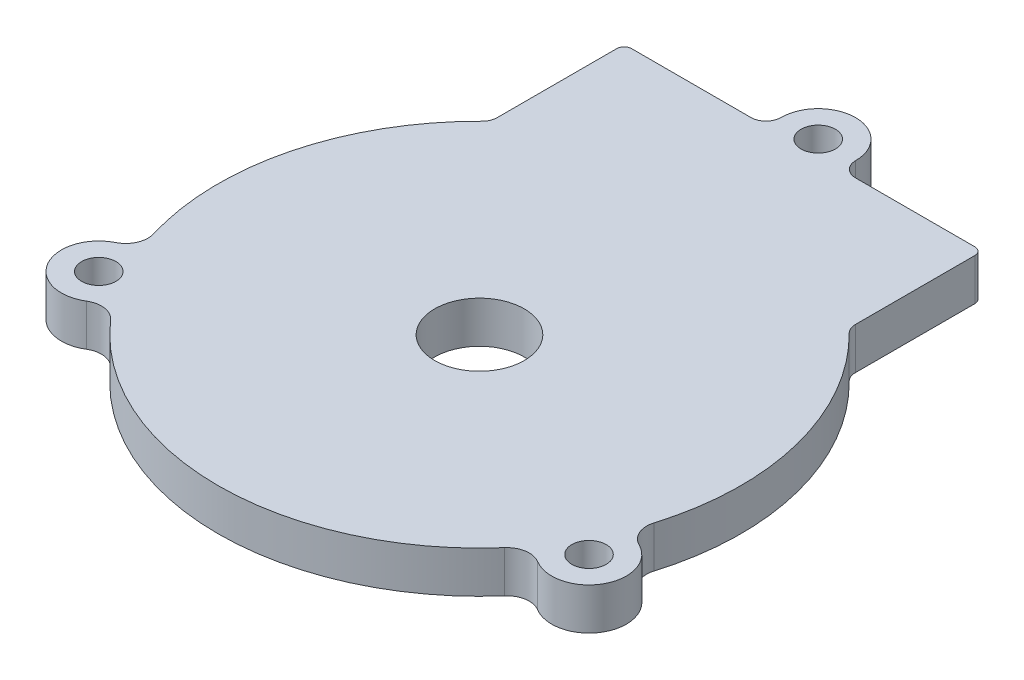
ISO-10303-21;
HEADER;
FILE_DESCRIPTION(('STEP AP214'),'2;1');
FILE_NAME('part.step','',(''),(''),'','','');
FILE_SCHEMA(('AUTOMOTIVE_DESIGN { 1 0 10303 214 1 1 1 1 }'));
ENDSEC;
DATA;
#1=APPLICATION_CONTEXT('core data for automotive mechanical design processes');
#2=APPLICATION_PROTOCOL_DEFINITION('international standard','automotive_design',2000,#1);
#3=PRODUCT_CONTEXT('',#1,'mechanical');
#4=PRODUCT('Part','Part','',(#3));
#5=PRODUCT_RELATED_PRODUCT_CATEGORY('part','',(#4));
#6=PRODUCT_DEFINITION_FORMATION('','',#4);
#7=PRODUCT_DEFINITION_CONTEXT('part definition',#1,'design');
#8=PRODUCT_DEFINITION('design','',#6,#7);
#9=PRODUCT_DEFINITION_SHAPE('','',#8);
#10=(LENGTH_UNIT() NAMED_UNIT(*) SI_UNIT(.MILLI.,.METRE.));
#11=(NAMED_UNIT(*) PLANE_ANGLE_UNIT() SI_UNIT($,.RADIAN.));
#12=(NAMED_UNIT(*) SI_UNIT($,.STERADIAN.) SOLID_ANGLE_UNIT());
#13=UNCERTAINTY_MEASURE_WITH_UNIT(LENGTH_MEASURE(1.E-05),#10,'distance_accuracy_value','');
#14=(GEOMETRIC_REPRESENTATION_CONTEXT(3) GLOBAL_UNCERTAINTY_ASSIGNED_CONTEXT((#13)) GLOBAL_UNIT_ASSIGNED_CONTEXT((#10,
#11,#12)) REPRESENTATION_CONTEXT('',''));
#15=CARTESIAN_POINT('',(0.,0.,0.));
#16=DIRECTION('',(0.,0.,1.));
#17=DIRECTION('',(1.,0.,0.));
#18=AXIS2_PLACEMENT_3D('',#15,#16,#17);
#19=CARTESIAN_POINT('',(32.785,5.588,-68.7014714818341));
#20=DIRECTION('',(0.,-1.,0.));
#21=DIRECTION('',(0.,0.,-1.));
#22=AXIS2_PLACEMENT_3D('',#19,#20,#21);
#23=CYLINDRICAL_SURFACE('',#22,5.);
#24=CARTESIAN_POINT('',(32.785,0.,-68.7014714818341));
#25=DIRECTION('',(0.,1.,0.));
#26=DIRECTION('',(0.,0.,1.));
#27=AXIS2_PLACEMENT_3D('',#24,#25,#26);
#28=CIRCLE('',#27,5.);
#29=CARTESIAN_POINT('',(37.785,0.,-68.7014714818341));
#30=VERTEX_POINT('',#29);
#31=CARTESIAN_POINT('',(27.785,0.,-68.7014714818341));
#32=VERTEX_POINT('',#31);
#33=EDGE_CURVE('E279',#30,#32,#28,.T.);
#34=ORIENTED_EDGE('',*,*,#33,.T.);
#35=DIRECTION('',(0.,-1.,0.));
#36=VECTOR('',#35,1.);
#37=CARTESIAN_POINT('',(27.785,5.588,-68.7014714818341));
#38=LINE('',#37,#36);
#39=CARTESIAN_POINT('',(27.785,5.588,-68.7014714818341));
#40=VERTEX_POINT('',#39);
#41=EDGE_CURVE('E312',#32,#40,#38,.F.);
#42=ORIENTED_EDGE('',*,*,#41,.T.);
#43=CARTESIAN_POINT('',(32.785,5.588,-68.7014714818341));
#44=DIRECTION('',(0.,1.,0.));
#45=DIRECTION('',(0.,0.,1.));
#46=AXIS2_PLACEMENT_3D('',#43,#44,#45);
#47=CIRCLE('',#46,5.);
#48=CARTESIAN_POINT('',(37.785,5.588,-68.7014714818341));
#49=VERTEX_POINT('',#48);
#50=EDGE_CURVE('E381',#49,#40,#47,.T.);
#51=ORIENTED_EDGE('',*,*,#50,.F.);
#52=DIRECTION('',(0.,-1.,0.));
#53=VECTOR('',#52,1.);
#54=CARTESIAN_POINT('',(37.785,5.588,-68.7014714818341));
#55=LINE('',#54,#53);
#56=EDGE_CURVE('E309',#49,#30,#55,.T.);
#57=ORIENTED_EDGE('',*,*,#56,.T.);
#58=EDGE_LOOP('',(#34,#42,#51,#57));
#59=FACE_BOUND('',#58,.T.);
#60=ADVANCED_FACE('F105',(#59),#23,.T.);
#61=CARTESIAN_POINT('',(56.765,5.588,-66.7014714818341));
#62=DIRECTION('',(0.,0.,1.));
#63=DIRECTION('',(1.,0.,0.));
#64=AXIS2_PLACEMENT_3D('',#61,#62,#63);
#65=PLANE('',#64);
#66=DIRECTION('',(-1.,0.,0.));
#67=VECTOR('',#66,1.);
#68=CARTESIAN_POINT('',(56.765,5.588,-66.7014714818341));
#69=LINE('',#68,#67);
#70=CARTESIAN_POINT('',(55.765,5.588,-66.7014714818341));
#71=VERTEX_POINT('',#70);
#72=CARTESIAN_POINT('',(39.785,5.588,-66.7014714818341));
#73=VERTEX_POINT('',#72);
#74=EDGE_CURVE('E364',#71,#73,#69,.T.);
#75=ORIENTED_EDGE('',*,*,#74,.F.);
#76=DIRECTION('',(0.,-1.,0.));
#77=VECTOR('',#76,1.);
#78=CARTESIAN_POINT('',(55.765,0.,-66.7014714818341));
#79=LINE('',#78,#77);
#80=CARTESIAN_POINT('',(55.765,0.,-66.7014714818341));
#81=VERTEX_POINT('',#80);
#82=EDGE_CURVE('E113',#71,#81,#79,.T.);
#83=ORIENTED_EDGE('',*,*,#82,.T.);
#84=DIRECTION('',(-1.,0.,0.));
#85=VECTOR('',#84,1.);
#86=CARTESIAN_POINT('',(56.765,0.,-66.7014714818341));
#87=LINE('',#86,#85);
#88=CARTESIAN_POINT('',(39.785,0.,-66.7014714818341));
#89=VERTEX_POINT('',#88);
#90=EDGE_CURVE('E363',#81,#89,#87,.T.);
#91=ORIENTED_EDGE('',*,*,#90,.T.);
#92=DIRECTION('',(0.,1.,0.));
#93=VECTOR('',#92,1.);
#94=CARTESIAN_POINT('',(39.785,5.588,-66.7014714818341));
#95=LINE('',#94,#93);
#96=EDGE_CURVE('E317',#89,#73,#95,.T.);
#97=ORIENTED_EDGE('',*,*,#96,.T.);
#98=EDGE_LOOP('',(#75,#83,#91,#97));
#99=FACE_BOUND('',#98,.T.);
#100=ADVANCED_FACE('F362',(#99),#65,.F.);
#101=CARTESIAN_POINT('',(65.600049900922,5.588,-5.20147148183409));
#102=DIRECTION('',(0.,-1.,0.));
#103=DIRECTION('',(0.,0.,-1.));
#104=AXIS2_PLACEMENT_3D('',#101,#102,#103);
#105=CYLINDRICAL_SURFACE('',#104,2.29999999999999);
#106=CARTESIAN_POINT('',(65.600049900922,5.588,-5.20147148183409));
#107=DIRECTION('',(0.,1.,0.));
#108=DIRECTION('',(0.,0.,1.));
#109=AXIS2_PLACEMENT_3D('',#106,#107,#108);
#110=CIRCLE('',#109,2.29999999999999);
#111=CARTESIAN_POINT('',(65.600049900922,5.588,-2.9014714818341));
#112=VERTEX_POINT('',#111);
#113=EDGE_CURVE('E405',#112,#112,#110,.T.);
#114=ORIENTED_EDGE('',*,*,#113,.T.);
#115=EDGE_LOOP('',(#114));
#116=FACE_BOUND('',#115,.T.);
#117=CARTESIAN_POINT('',(65.600049900922,0.,-5.20147148183409));
#118=DIRECTION('',(0.,1.,0.));
#119=DIRECTION('',(0.,0.,1.));
#120=AXIS2_PLACEMENT_3D('',#117,#118,#119);
#121=CIRCLE('',#120,2.29999999999999);
#122=CARTESIAN_POINT('',(65.600049900922,0.,-2.9014714818341));
#123=VERTEX_POINT('',#122);
#124=EDGE_CURVE('E409',#123,#123,#121,.T.);
#125=ORIENTED_EDGE('',*,*,#124,.F.);
#126=EDGE_LOOP('',(#125));
#127=FACE_BOUND('',#126,.T.);
#128=ADVANCED_FACE('F490',(#116,#127),#105,.F.);
#129=CARTESIAN_POINT('',(25.785,0.,-66.7014714818341));
#130=VERTEX_POINT('',#129);
#131=CARTESIAN_POINT('',(9.80499999999999,0.,-66.7014714818341));
#132=VERTEX_POINT('',#131);
#133=EDGE_CURVE('E373',#130,#132,#87,.T.);
#134=ORIENTED_EDGE('',*,*,#133,.T.);
#135=DIRECTION('',(0.,-1.,0.));
#136=VECTOR('',#135,1.);
#137=CARTESIAN_POINT('',(9.80499999999999,5.588,-66.7014714818341));
#138=LINE('',#137,#136);
#139=CARTESIAN_POINT('',(9.80499999999999,5.588,-66.7014714818341));
#140=VERTEX_POINT('',#139);
#141=EDGE_CURVE('E354',#132,#140,#138,.F.);
#142=ORIENTED_EDGE('',*,*,#141,.T.);
#143=CARTESIAN_POINT('',(25.785,5.588,-66.7014714818341));
#144=VERTEX_POINT('',#143);
#145=EDGE_CURVE('E427',#144,#140,#69,.T.);
#146=ORIENTED_EDGE('',*,*,#145,.F.);
#147=DIRECTION('',(0.,1.,0.));
#148=VECTOR('',#147,1.);
#149=CARTESIAN_POINT('',(25.785,0.,-66.7014714818341));
#150=LINE('',#149,#148);
#151=EDGE_CURVE('E315',#144,#130,#150,.F.);
#152=ORIENTED_EDGE('',*,*,#151,.T.);
#153=EDGE_LOOP('',(#134,#142,#146,#152));
#154=FACE_BOUND('',#153,.T.);
#155=ADVANCED_FACE('F492',(#154),#65,.F.);
#156=CARTESIAN_POINT('',(56.765,5.588,-66.7014714818341));
#157=DIRECTION('',(1.,0.,0.));
#158=DIRECTION('',(0.,0.,-1.));
#159=AXIS2_PLACEMENT_3D('',#156,#157,#158);
#160=PLANE('',#159);
#161=DIRECTION('',(0.,0.,1.));
#162=VECTOR('',#161,1.);
#163=CARTESIAN_POINT('',(56.765,0.,-66.7014714818341));
#164=LINE('',#163,#162);
#165=CARTESIAN_POINT('',(56.765,0.,-65.7014714818341));
#166=VERTEX_POINT('',#165);
#167=CARTESIAN_POINT('',(56.765,0.,-49.6961028134736));
#168=VERTEX_POINT('',#167);
#169=EDGE_CURVE('E383',#166,#168,#164,.T.);
#170=ORIENTED_EDGE('',*,*,#169,.F.);
#171=DIRECTION('',(0.,-1.,0.));
#172=VECTOR('',#171,1.);
#173=CARTESIAN_POINT('',(56.765,5.588,-65.7014714818341));
#174=LINE('',#173,#172);
#175=CARTESIAN_POINT('',(56.765,5.588,-65.7014714818341));
#176=VERTEX_POINT('',#175);
#177=EDGE_CURVE('E12',#166,#176,#174,.F.);
#178=ORIENTED_EDGE('',*,*,#177,.T.);
#179=DIRECTION('',(0.,0.,1.));
#180=VECTOR('',#179,1.);
#181=CARTESIAN_POINT('',(56.765,5.588,-66.7014714818341));
#182=LINE('',#181,#180);
#183=CARTESIAN_POINT('',(56.765,5.588,-49.6961028134736));
#184=VERTEX_POINT('',#183);
#185=EDGE_CURVE('E372',#176,#184,#182,.T.);
#186=ORIENTED_EDGE('',*,*,#185,.T.);
#187=DIRECTION('',(0.,-1.,0.));
#188=VECTOR('',#187,1.);
#189=CARTESIAN_POINT('',(56.765,5.588,-49.6961028134736));
#190=LINE('',#189,#188);
#191=EDGE_CURVE('E330',#184,#168,#190,.T.);
#192=ORIENTED_EDGE('',*,*,#191,.T.);
#193=EDGE_LOOP('',(#170,#178,#186,#192));
#194=FACE_BOUND('',#193,.T.);
#195=ADVANCED_FACE('F495',(#194),#160,.T.);
#196=CARTESIAN_POINT('',(65.600049900922,5.588,-5.20147148183409));
#197=DIRECTION('',(0.,-1.,0.));
#198=DIRECTION('',(0.,0.,-1.));
#199=AXIS2_PLACEMENT_3D('',#196,#197,#198);
#200=CYLINDRICAL_SURFACE('',#199,5.);
#201=CARTESIAN_POINT('',(65.600049900922,0.,-5.20147148183409));
#202=DIRECTION('',(0.,1.,0.));
#203=DIRECTION('',(0.,0.,1.));
#204=AXIS2_PLACEMENT_3D('',#201,#202,#203);
#205=CIRCLE('',#204,5.);
#206=CARTESIAN_POINT('',(62.9909459014365,0.,-0.936195837767345));
#207=VERTEX_POINT('',#206);
#208=CARTESIAN_POINT('',(67.8263116515634,0.,-9.67849712590082));
#209=VERTEX_POINT('',#208);
#210=EDGE_CURVE('E408',#207,#209,#205,.T.);
#211=ORIENTED_EDGE('',*,*,#210,.T.);
#212=DIRECTION('',(0.,-1.,0.));
#213=VECTOR('',#212,1.);
#214=CARTESIAN_POINT('',(67.8263116515634,5.588,-9.67849712590082));
#215=LINE('',#214,#213);
#216=CARTESIAN_POINT('',(67.8263116515634,5.588,-9.67849712590082));
#217=VERTEX_POINT('',#216);
#218=EDGE_CURVE('E273',#209,#217,#215,.F.);
#219=ORIENTED_EDGE('',*,*,#218,.T.);
#220=CARTESIAN_POINT('',(65.600049900922,5.588,-5.20147148183409));
#221=DIRECTION('',(0.,1.,0.));
#222=DIRECTION('',(0.,0.,1.));
#223=AXIS2_PLACEMENT_3D('',#220,#221,#222);
#224=CIRCLE('',#223,5.);
#225=CARTESIAN_POINT('',(62.9909459014365,5.588,-0.936195837767345));
#226=VERTEX_POINT('',#225);
#227=EDGE_CURVE('E249',#226,#217,#224,.T.);
#228=ORIENTED_EDGE('',*,*,#227,.F.);
#229=DIRECTION('',(0.,-1.,0.));
#230=VECTOR('',#229,1.);
#231=CARTESIAN_POINT('',(62.9909459014365,5.588,-0.936195837767345));
#232=LINE('',#231,#230);
#233=EDGE_CURVE('E270',#226,#207,#232,.T.);
#234=ORIENTED_EDGE('',*,*,#233,.T.);
#235=EDGE_LOOP('',(#211,#219,#228,#234));
#236=FACE_BOUND('',#235,.T.);
#237=ADVANCED_FACE('F475',(#236),#200,.T.);
#238=CARTESIAN_POINT('',(8.80499999999999,5.588,-66.7014714818341));
#239=DIRECTION('',(1.,0.,0.));
#240=DIRECTION('',(0.,0.,-1.));
#241=AXIS2_PLACEMENT_3D('',#238,#239,#240);
#242=PLANE('',#241);
#243=DIRECTION('',(0.,0.,1.));
#244=VECTOR('',#243,1.);
#245=CARTESIAN_POINT('',(8.80499999999999,5.588,-66.7014714818341));
#246=LINE('',#245,#244);
#247=CARTESIAN_POINT('',(8.80499999999999,5.588,-65.7014714818341));
#248=VERTEX_POINT('',#247);
#249=CARTESIAN_POINT('',(8.80499999999999,5.588,-49.6961028134736));
#250=VERTEX_POINT('',#249);
#251=EDGE_CURVE('E375',#248,#250,#246,.T.);
#252=ORIENTED_EDGE('',*,*,#251,.F.);
#253=DIRECTION('',(0.,-1.,0.));
#254=VECTOR('',#253,1.);
#255=CARTESIAN_POINT('',(8.80499999999999,5.588,-65.7014714818341));
#256=LINE('',#255,#254);
#257=CARTESIAN_POINT('',(8.80499999999999,0.,-65.7014714818341));
#258=VERTEX_POINT('',#257);
#259=EDGE_CURVE('E347',#248,#258,#256,.T.);
#260=ORIENTED_EDGE('',*,*,#259,.T.);
#261=DIRECTION('',(0.,0.,1.));
#262=VECTOR('',#261,1.);
#263=CARTESIAN_POINT('',(8.80499999999999,0.,-66.7014714818341));
#264=LINE('',#263,#262);
#265=CARTESIAN_POINT('',(8.80499999999999,0.,-49.6961028134736));
#266=VERTEX_POINT('',#265);
#267=EDGE_CURVE('E378',#258,#266,#264,.T.);
#268=ORIENTED_EDGE('',*,*,#267,.T.);
#269=DIRECTION('',(0.,1.,0.));
#270=VECTOR('',#269,1.);
#271=CARTESIAN_POINT('',(8.80499999999999,5.588,-49.6961028134736));
#272=LINE('',#271,#270);
#273=EDGE_CURVE('E333',#266,#250,#272,.T.);
#274=ORIENTED_EDGE('',*,*,#273,.T.);
#275=EDGE_LOOP('',(#252,#260,#268,#274));
#276=FACE_BOUND('',#275,.T.);
#277=ADVANCED_FACE('F438',(#276),#242,.F.);
#278=CARTESIAN_POINT('',(32.785,5.588,-23.3514714818341));
#279=DIRECTION('',(0.,-1.,0.));
#280=DIRECTION('',(0.,0.,-1.));
#281=AXIS2_PLACEMENT_3D('',#278,#279,#280);
#282=CYLINDRICAL_SURFACE('',#281,6.);
#283=CARTESIAN_POINT('',(32.785,5.588,-23.3514714818341));
#284=DIRECTION('',(0.,1.,0.));
#285=DIRECTION('',(0.,0.,1.));
#286=AXIS2_PLACEMENT_3D('',#283,#284,#285);
#287=CIRCLE('',#286,6.);
#288=CARTESIAN_POINT('',(32.785,5.588,-17.3514714818341));
#289=VERTEX_POINT('',#288);
#290=EDGE_CURVE('E415',#289,#289,#287,.T.);
#291=ORIENTED_EDGE('',*,*,#290,.T.);
#292=EDGE_LOOP('',(#291));
#293=FACE_BOUND('',#292,.T.);
#294=CARTESIAN_POINT('',(32.785,0.,-23.3514714818341));
#295=DIRECTION('',(0.,1.,0.));
#296=DIRECTION('',(0.,0.,1.));
#297=AXIS2_PLACEMENT_3D('',#294,#295,#296);
#298=CIRCLE('',#297,6.);
#299=CARTESIAN_POINT('',(32.785,0.,-17.3514714818341));
#300=VERTEX_POINT('',#299);
#301=EDGE_CURVE('E419',#300,#300,#298,.T.);
#302=ORIENTED_EDGE('',*,*,#301,.F.);
#303=EDGE_LOOP('',(#302));
#304=FACE_BOUND('',#303,.T.);
#305=ADVANCED_FACE('F561',(#293,#304),#282,.F.);
#306=CARTESIAN_POINT('',(32.785,5.588,-23.3514714818341));
#307=DIRECTION('',(0.,-1.,0.));
#308=DIRECTION('',(0.,0.,-1.));
#309=AXIS2_PLACEMENT_3D('',#306,#307,#308);
#310=CYLINDRICAL_SURFACE('',#309,35.);
#311=CARTESIAN_POINT('',(32.785,5.588,-23.3514714818341));
#312=DIRECTION('',(0.,1.,0.));
#313=DIRECTION('',(0.,0.,1.));
#314=AXIS2_PLACEMENT_3D('',#311,#312,#313);
#315=CIRCLE('',#314,35.);
#316=CARTESIAN_POINT('',(8.20932432432432,5.588,-48.272068687439));
#317=VERTEX_POINT('',#316);
#318=CARTESIAN_POINT('',(-0.720194857057592,5.588,-13.2320882204588));
#319=VERTEX_POINT('',#318);
#320=EDGE_CURVE('E268',#317,#319,#315,.T.);
#321=ORIENTED_EDGE('',*,*,#320,.F.);
#322=DIRECTION('',(0.,-1.,0.));
#323=VECTOR('',#322,1.);
#324=CARTESIAN_POINT('',(8.20932432432431,5.588,-48.272068687439));
#325=LINE('',#324,#323);
#326=CARTESIAN_POINT('',(8.20932432432432,0.,-48.272068687439));
#327=VERTEX_POINT('',#326);
#328=EDGE_CURVE('E336',#317,#327,#325,.T.);
#329=ORIENTED_EDGE('',*,*,#328,.T.);
#330=CARTESIAN_POINT('',(32.785,0.,-23.3514714818341));
#331=DIRECTION('',(0.,1.,0.));
#332=DIRECTION('',(0.,0.,1.));
#333=AXIS2_PLACEMENT_3D('',#330,#331,#332);
#334=CIRCLE('',#333,35.);
#335=CARTESIAN_POINT('',(-0.720194857057592,0.,-13.2320882204588));
#336=VERTEX_POINT('',#335);
#337=EDGE_CURVE('E266',#327,#336,#334,.T.);
#338=ORIENTED_EDGE('',*,*,#337,.T.);
#339=DIRECTION('',(0.,-1.,0.));
#340=VECTOR('',#339,1.);
#341=CARTESIAN_POINT('',(-0.720194857057592,5.588,-13.2320882204588));
#342=LINE('',#341,#340);
#343=EDGE_CURVE('E289',#336,#319,#342,.F.);
#344=ORIENTED_EDGE('',*,*,#343,.T.);
#345=EDGE_LOOP('',(#321,#329,#338,#344));
#346=FACE_BOUND('',#345,.T.);
#347=ADVANCED_FACE('F450',(#346),#310,.T.);
#348=CARTESIAN_POINT('',(66.2901948570576,0.,-13.2320882204588));
#349=VERTEX_POINT('',#348);
#350=CARTESIAN_POINT('',(57.3606756756757,0.,-48.272068687439));
#351=VERTEX_POINT('',#350);
#352=EDGE_CURVE('E418',#349,#351,#334,.T.);
#353=ORIENTED_EDGE('',*,*,#352,.T.);
#354=DIRECTION('',(0.,-1.,0.));
#355=VECTOR('',#354,1.);
#356=CARTESIAN_POINT('',(57.3606756756757,5.588,-48.272068687439));
#357=LINE('',#356,#355);
#358=CARTESIAN_POINT('',(57.3606756756757,5.588,-48.272068687439));
#359=VERTEX_POINT('',#358);
#360=EDGE_CURVE('E264',#351,#359,#357,.F.);
#361=ORIENTED_EDGE('',*,*,#360,.T.);
#362=CARTESIAN_POINT('',(66.2901948570576,5.588,-13.2320882204588));
#363=VERTEX_POINT('',#362);
#364=EDGE_CURVE('E247',#363,#359,#315,.T.);
#365=ORIENTED_EDGE('',*,*,#364,.F.);
#366=DIRECTION('',(0.,-1.,0.));
#367=VECTOR('',#366,1.);
#368=CARTESIAN_POINT('',(66.2901948570576,5.588,-13.2320882204588));
#369=LINE('',#368,#367);
#370=EDGE_CURVE('E261',#363,#349,#369,.T.);
#371=ORIENTED_EDGE('',*,*,#370,.T.);
#372=EDGE_LOOP('',(#353,#361,#365,#371));
#373=FACE_BOUND('',#372,.T.);
#374=ADVANCED_FACE('F260',(#373),#310,.T.);
#375=CARTESIAN_POINT('',(6.40560730102413,0.,-0.348696848472562));
#376=VERTEX_POINT('',#375);
#377=CARTESIAN_POINT('',(59.1643926989759,0.,-0.348696848472559));
#378=VERTEX_POINT('',#377);
#379=EDGE_CURVE('E423',#376,#378,#334,.T.);
#380=ORIENTED_EDGE('',*,*,#379,.T.);
#381=DIRECTION('',(0.,-1.,0.));
#382=VECTOR('',#381,1.);
#383=CARTESIAN_POINT('',(59.1643926989759,5.588,-0.348696848472559));
#384=LINE('',#383,#382);
#385=CARTESIAN_POINT('',(59.1643926989759,5.588,-0.348696848472559));
#386=VERTEX_POINT('',#385);
#387=EDGE_CURVE('E286',#378,#386,#384,.F.);
#388=ORIENTED_EDGE('',*,*,#387,.T.);
#389=CARTESIAN_POINT('',(6.40560730102413,5.588,-0.348696848472562));
#390=VERTEX_POINT('',#389);
#391=EDGE_CURVE('E265',#390,#386,#315,.T.);
#392=ORIENTED_EDGE('',*,*,#391,.F.);
#393=DIRECTION('',(0.,-1.,0.));
#394=VECTOR('',#393,1.);
#395=CARTESIAN_POINT('',(6.40560730102413,5.588,-0.348696848472562));
#396=LINE('',#395,#394);
#397=EDGE_CURVE('E283',#390,#376,#396,.T.);
#398=ORIENTED_EDGE('',*,*,#397,.T.);
#399=EDGE_LOOP('',(#380,#388,#392,#398));
#400=FACE_BOUND('',#399,.T.);
#401=ADVANCED_FACE('F467',(#400),#310,.T.);
#402=CARTESIAN_POINT('',(-0.0300499009219918,5.588,-5.20147148183409));
#403=DIRECTION('',(0.,-1.,0.));
#404=DIRECTION('',(0.,0.,-1.));
#405=AXIS2_PLACEMENT_3D('',#402,#403,#404);
#406=CYLINDRICAL_SURFACE('',#405,2.3);
#407=CARTESIAN_POINT('',(-0.0300499009219918,5.588,-5.20147148183409));
#408=DIRECTION('',(0.,1.,0.));
#409=DIRECTION('',(0.,0.,1.));
#410=AXIS2_PLACEMENT_3D('',#407,#408,#409);
#411=CIRCLE('',#410,2.3);
#412=CARTESIAN_POINT('',(-0.0300499009219918,5.588,-2.90147148183409));
#413=VERTEX_POINT('',#412);
#414=EDGE_CURVE('E397',#413,#413,#411,.T.);
#415=ORIENTED_EDGE('',*,*,#414,.T.);
#416=EDGE_LOOP('',(#415));
#417=FACE_BOUND('',#416,.T.);
#418=CARTESIAN_POINT('',(-0.0300499009219918,0.,-5.20147148183409));
#419=DIRECTION('',(0.,1.,0.));
#420=DIRECTION('',(0.,0.,1.));
#421=AXIS2_PLACEMENT_3D('',#418,#419,#420);
#422=CIRCLE('',#421,2.3);
#423=CARTESIAN_POINT('',(-0.0300499009219918,0.,-2.90147148183409));
#424=VERTEX_POINT('',#423);
#425=EDGE_CURVE('E400',#424,#424,#422,.T.);
#426=ORIENTED_EDGE('',*,*,#425,.F.);
#427=EDGE_LOOP('',(#426));
#428=FACE_BOUND('',#427,.T.);
#429=ADVANCED_FACE('F550',(#417,#428),#406,.F.);
#430=CARTESIAN_POINT('',(-0.0300499009219918,0.,-5.20147148183409));
#431=DIRECTION('',(0.,1.,0.));
#432=DIRECTION('',(0.,0.,1.));
#433=AXIS2_PLACEMENT_3D('',#430,#431,#432);
#434=PLANE('',#433);
#435=CARTESIAN_POINT('',(32.785,0.,-68.7014714818341));
#436=DIRECTION('',(0.,1.,0.));
#437=DIRECTION('',(0.,0.,1.));
#438=AXIS2_PLACEMENT_3D('',#435,#436,#437);
#439=CIRCLE('',#438,2.3);
#440=CARTESIAN_POINT('',(32.785,0.,-66.4014714818341));
#441=VERTEX_POINT('',#440);
#442=EDGE_CURVE('E386',#441,#441,#439,.T.);
#443=ORIENTED_EDGE('',*,*,#442,.T.);
#444=EDGE_LOOP('',(#443));
#445=FACE_BOUND('',#444,.T.);
#446=ORIENTED_EDGE('',*,*,#267,.F.);
#447=CARTESIAN_POINT('',(9.80499999999999,0.,-65.7014714818341));
#448=DIRECTION('',(0.,1.,0.));
#449=DIRECTION('',(0.,0.,1.));
#450=AXIS2_PLACEMENT_3D('',#447,#448,#449);
#451=CIRCLE('',#450,1.);
#452=EDGE_CURVE('E352',#258,#132,#451,.F.);
#453=ORIENTED_EDGE('',*,*,#452,.T.);
#454=ORIENTED_EDGE('',*,*,#133,.F.);
#455=CARTESIAN_POINT('',(25.785,0.,-68.7014714818341));
#456=DIRECTION('',(0.,1.,0.));
#457=DIRECTION('',(0.,0.,1.));
#458=AXIS2_PLACEMENT_3D('',#455,#456,#457);
#459=CIRCLE('',#458,2.);
#460=EDGE_CURVE('E322',#130,#32,#459,.T.);
#461=ORIENTED_EDGE('',*,*,#460,.T.);
#462=ORIENTED_EDGE('',*,*,#33,.F.);
#463=CARTESIAN_POINT('',(39.785,0.,-68.7014714818341));
#464=DIRECTION('',(0.,1.,0.));
#465=DIRECTION('',(0.,0.,1.));
#466=AXIS2_PLACEMENT_3D('',#463,#464,#465);
#467=CIRCLE('',#466,2.);
#468=EDGE_CURVE('E324',#30,#89,#467,.T.);
#469=ORIENTED_EDGE('',*,*,#468,.T.);
#470=ORIENTED_EDGE('',*,*,#90,.F.);
#471=CARTESIAN_POINT('',(55.765,0.,-65.7014714818341));
#472=DIRECTION('',(0.,1.,0.));
#473=DIRECTION('',(0.,0.,1.));
#474=AXIS2_PLACEMENT_3D('',#471,#472,#473);
#475=CIRCLE('',#474,1.);
#476=EDGE_CURVE('E350',#81,#166,#475,.F.);
#477=ORIENTED_EDGE('',*,*,#476,.T.);
#478=ORIENTED_EDGE('',*,*,#169,.T.);
#479=CARTESIAN_POINT('',(58.765,0.,-49.6961028134736));
#480=DIRECTION('',(0.,1.,0.));
#481=DIRECTION('',(0.,0.,1.));
#482=AXIS2_PLACEMENT_3D('',#479,#480,#481);
#483=CIRCLE('',#482,2.);
#484=EDGE_CURVE('E340',#168,#351,#483,.T.);
#485=ORIENTED_EDGE('',*,*,#484,.T.);
#486=ORIENTED_EDGE('',*,*,#352,.F.);
#487=CARTESIAN_POINT('',(69.1620687019482,0.,-12.3647125123409));
#488=DIRECTION('',(0.,1.,0.));
#489=DIRECTION('',(0.,0.,1.));
#490=AXIS2_PLACEMENT_3D('',#487,#488,#489);
#491=CIRCLE('',#490,3.);
#492=EDGE_CURVE('E254',#349,#209,#491,.T.);
#493=ORIENTED_EDGE('',*,*,#492,.T.);
#494=ORIENTED_EDGE('',*,*,#210,.F.);
#495=CARTESIAN_POINT('',(61.4254835017452,0.,1.62296954867271));
#496=DIRECTION('',(0.,1.,0.));
#497=DIRECTION('',(0.,0.,1.));
#498=AXIS2_PLACEMENT_3D('',#495,#496,#497);
#499=CIRCLE('',#498,3.);
#500=EDGE_CURVE('E298',#207,#378,#499,.T.);
#501=ORIENTED_EDGE('',*,*,#500,.T.);
#502=ORIENTED_EDGE('',*,*,#379,.F.);
#503=CARTESIAN_POINT('',(4.14451649825476,0.,1.62296954867271));
#504=DIRECTION('',(0.,1.,0.));
#505=DIRECTION('',(0.,0.,1.));
#506=AXIS2_PLACEMENT_3D('',#503,#504,#505);
#507=CIRCLE('',#506,3.);
#508=CARTESIAN_POINT('',(2.57905409856348,0.,-0.936195837767343));
#509=VERTEX_POINT('',#508);
#510=EDGE_CURVE('E305',#376,#509,#507,.T.);
#511=ORIENTED_EDGE('',*,*,#510,.T.);
#512=CARTESIAN_POINT('',(-0.0300499009219918,0.,-5.20147148183409));
#513=DIRECTION('',(0.,1.,0.));
#514=DIRECTION('',(0.,0.,1.));
#515=AXIS2_PLACEMENT_3D('',#512,#513,#514);
#516=CIRCLE('',#515,5.);
#517=CARTESIAN_POINT('',(-2.2563116515634,0.,-9.67849712590082));
#518=VERTEX_POINT('',#517);
#519=EDGE_CURVE('E276',#518,#509,#516,.T.);
#520=ORIENTED_EDGE('',*,*,#519,.F.);
#521=CARTESIAN_POINT('',(-3.59206870194825,0.,-12.3647125123409));
#522=DIRECTION('',(0.,1.,0.));
#523=DIRECTION('',(0.,0.,1.));
#524=AXIS2_PLACEMENT_3D('',#521,#522,#523);
#525=CIRCLE('',#524,3.);
#526=EDGE_CURVE('E302',#518,#336,#525,.T.);
#527=ORIENTED_EDGE('',*,*,#526,.T.);
#528=ORIENTED_EDGE('',*,*,#337,.F.);
#529=CARTESIAN_POINT('',(6.80499999999999,0.,-49.6961028134736));
#530=DIRECTION('',(0.,1.,0.));
#531=DIRECTION('',(0.,0.,1.));
#532=AXIS2_PLACEMENT_3D('',#529,#530,#531);
#533=CIRCLE('',#532,2.);
#534=EDGE_CURVE('E344',#327,#266,#533,.T.);
#535=ORIENTED_EDGE('',*,*,#534,.T.);
#536=EDGE_LOOP('',(#446,#453,#454,#461,#462,#469,#470,#477,#478,#485,#486,#493,#494,#501,#502,
#511,#520,#527,#528,#535));
#537=FACE_BOUND('',#536,.T.);
#538=ORIENTED_EDGE('',*,*,#425,.T.);
#539=EDGE_LOOP('',(#538));
#540=FACE_BOUND('',#539,.T.);
#541=ORIENTED_EDGE('',*,*,#301,.T.);
#542=EDGE_LOOP('',(#541));
#543=FACE_BOUND('',#542,.T.);
#544=ORIENTED_EDGE('',*,*,#124,.T.);
#545=EDGE_LOOP('',(#544));
#546=FACE_BOUND('',#545,.T.);
#547=ADVANCED_FACE('F368',(#445,#537,#540,#543,#546),#434,.F.);
#548=CARTESIAN_POINT('',(-0.0300499009219918,5.588,-5.20147148183409));
#549=DIRECTION('',(0.,1.,0.));
#550=DIRECTION('',(0.,0.,1.));
#551=AXIS2_PLACEMENT_3D('',#548,#549,#550);
#552=PLANE('',#551);
#553=CARTESIAN_POINT('',(32.785,5.588,-68.7014714818341));
#554=DIRECTION('',(0.,1.,0.));
#555=DIRECTION('',(0.,0.,1.));
#556=AXIS2_PLACEMENT_3D('',#553,#554,#555);
#557=CIRCLE('',#556,2.3);
#558=CARTESIAN_POINT('',(32.785,5.588,-66.4014714818341));
#559=VERTEX_POINT('',#558);
#560=EDGE_CURVE('E390',#559,#559,#557,.T.);
#561=ORIENTED_EDGE('',*,*,#560,.F.);
#562=EDGE_LOOP('',(#561));
#563=FACE_BOUND('',#562,.T.);
#564=ORIENTED_EDGE('',*,*,#145,.T.);
#565=CARTESIAN_POINT('',(9.80499999999999,5.588,-65.7014714818341));
#566=DIRECTION('',(0.,1.,0.));
#567=DIRECTION('',(0.,0.,1.));
#568=AXIS2_PLACEMENT_3D('',#565,#566,#567);
#569=CIRCLE('',#568,1.);
#570=EDGE_CURVE('E357',#140,#248,#569,.T.);
#571=ORIENTED_EDGE('',*,*,#570,.T.);
#572=ORIENTED_EDGE('',*,*,#251,.T.);
#573=CARTESIAN_POINT('',(6.80499999999999,5.588,-49.6961028134736));
#574=DIRECTION('',(0.,1.,0.));
#575=DIRECTION('',(0.,0.,1.));
#576=AXIS2_PLACEMENT_3D('',#573,#574,#575);
#577=CIRCLE('',#576,2.);
#578=EDGE_CURVE('E342',#250,#317,#577,.F.);
#579=ORIENTED_EDGE('',*,*,#578,.T.);
#580=ORIENTED_EDGE('',*,*,#320,.T.);
#581=CARTESIAN_POINT('',(-3.59206870194825,5.588,-12.3647125123409));
#582=DIRECTION('',(0.,1.,0.));
#583=DIRECTION('',(0.,0.,1.));
#584=AXIS2_PLACEMENT_3D('',#581,#582,#583);
#585=CIRCLE('',#584,3.);
#586=CARTESIAN_POINT('',(-2.2563116515634,5.588,-9.67849712590082));
#587=VERTEX_POINT('',#586);
#588=EDGE_CURVE('E300',#319,#587,#585,.F.);
#589=ORIENTED_EDGE('',*,*,#588,.T.);
#590=CARTESIAN_POINT('',(-0.0300499009219918,5.588,-5.20147148183409));
#591=DIRECTION('',(0.,1.,0.));
#592=DIRECTION('',(0.,0.,1.));
#593=AXIS2_PLACEMENT_3D('',#590,#591,#592);
#594=CIRCLE('',#593,5.);
#595=CARTESIAN_POINT('',(2.57905409856348,5.588,-0.936195837767343));
#596=VERTEX_POINT('',#595);
#597=EDGE_CURVE('E271',#587,#596,#594,.T.);
#598=ORIENTED_EDGE('',*,*,#597,.T.);
#599=CARTESIAN_POINT('',(4.14451649825476,5.588,1.62296954867271));
#600=DIRECTION('',(0.,1.,0.));
#601=DIRECTION('',(0.,0.,1.));
#602=AXIS2_PLACEMENT_3D('',#599,#600,#601);
#603=CIRCLE('',#602,3.);
#604=EDGE_CURVE('E307',#596,#390,#603,.F.);
#605=ORIENTED_EDGE('',*,*,#604,.T.);
#606=ORIENTED_EDGE('',*,*,#391,.T.);
#607=CARTESIAN_POINT('',(61.4254835017452,5.588,1.62296954867271));
#608=DIRECTION('',(0.,1.,0.));
#609=DIRECTION('',(0.,0.,1.));
#610=AXIS2_PLACEMENT_3D('',#607,#608,#609);
#611=CIRCLE('',#610,3.);
#612=EDGE_CURVE('E253',#386,#226,#611,.F.);
#613=ORIENTED_EDGE('',*,*,#612,.T.);
#614=ORIENTED_EDGE('',*,*,#227,.T.);
#615=CARTESIAN_POINT('',(69.1620687019482,5.588,-12.3647125123409));
#616=DIRECTION('',(0.,1.,0.));
#617=DIRECTION('',(0.,0.,1.));
#618=AXIS2_PLACEMENT_3D('',#615,#616,#617);
#619=CIRCLE('',#618,3.);
#620=EDGE_CURVE('E241',#217,#363,#619,.F.);
#621=ORIENTED_EDGE('',*,*,#620,.T.);
#622=ORIENTED_EDGE('',*,*,#364,.T.);
#623=CARTESIAN_POINT('',(58.765,5.588,-49.6961028134736));
#624=DIRECTION('',(0.,1.,0.));
#625=DIRECTION('',(0.,0.,1.));
#626=AXIS2_PLACEMENT_3D('',#623,#624,#625);
#627=CIRCLE('',#626,2.);
#628=EDGE_CURVE('E338',#359,#184,#627,.F.);
#629=ORIENTED_EDGE('',*,*,#628,.T.);
#630=ORIENTED_EDGE('',*,*,#185,.F.);
#631=CARTESIAN_POINT('',(55.765,5.588,-65.7014714818341));
#632=DIRECTION('',(0.,1.,0.));
#633=DIRECTION('',(0.,0.,1.));
#634=AXIS2_PLACEMENT_3D('',#631,#632,#633);
#635=CIRCLE('',#634,1.);
#636=EDGE_CURVE('E120',#176,#71,#635,.T.);
#637=ORIENTED_EDGE('',*,*,#636,.T.);
#638=ORIENTED_EDGE('',*,*,#74,.T.);
#639=CARTESIAN_POINT('',(39.785,5.588,-68.7014714818341));
#640=DIRECTION('',(0.,1.,0.));
#641=DIRECTION('',(0.,0.,1.));
#642=AXIS2_PLACEMENT_3D('',#639,#640,#641);
#643=CIRCLE('',#642,2.);
#644=EDGE_CURVE('E327',#73,#49,#643,.F.);
#645=ORIENTED_EDGE('',*,*,#644,.T.);
#646=ORIENTED_EDGE('',*,*,#50,.T.);
#647=CARTESIAN_POINT('',(25.785,5.588,-68.7014714818341));
#648=DIRECTION('',(0.,1.,0.));
#649=DIRECTION('',(0.,0.,1.));
#650=AXIS2_PLACEMENT_3D('',#647,#648,#649);
#651=CIRCLE('',#650,2.);
#652=EDGE_CURVE('E320',#40,#144,#651,.F.);
#653=ORIENTED_EDGE('',*,*,#652,.T.);
#654=EDGE_LOOP('',(#564,#571,#572,#579,#580,#589,#598,#605,#606,#613,#614,#621,#622,#629,#630,
#637,#638,#645,#646,#653));
#655=FACE_BOUND('',#654,.T.);
#656=ORIENTED_EDGE('',*,*,#414,.F.);
#657=EDGE_LOOP('',(#656));
#658=FACE_BOUND('',#657,.T.);
#659=ORIENTED_EDGE('',*,*,#290,.F.);
#660=EDGE_LOOP('',(#659));
#661=FACE_BOUND('',#660,.T.);
#662=ORIENTED_EDGE('',*,*,#113,.F.);
#663=EDGE_LOOP('',(#662));
#664=FACE_BOUND('',#663,.T.);
#665=ADVANCED_FACE('F244',(#563,#655,#658,#661,#664),#552,.T.);
#666=CARTESIAN_POINT('',(-0.0300499009219918,5.588,-5.20147148183409));
#667=DIRECTION('',(0.,-1.,0.));
#668=DIRECTION('',(0.,0.,-1.));
#669=AXIS2_PLACEMENT_3D('',#666,#667,#668);
#670=CYLINDRICAL_SURFACE('',#669,5.);
#671=ORIENTED_EDGE('',*,*,#597,.F.);
#672=DIRECTION('',(0.,-1.,0.));
#673=VECTOR('',#672,1.);
#674=CARTESIAN_POINT('',(-2.2563116515634,5.588,-9.67849712590082));
#675=LINE('',#674,#673);
#676=EDGE_CURVE('E294',#587,#518,#675,.T.);
#677=ORIENTED_EDGE('',*,*,#676,.T.);
#678=ORIENTED_EDGE('',*,*,#519,.T.);
#679=DIRECTION('',(0.,-1.,0.));
#680=VECTOR('',#679,1.);
#681=CARTESIAN_POINT('',(2.57905409856348,5.588,-0.936195837767343));
#682=LINE('',#681,#680);
#683=EDGE_CURVE('E292',#509,#596,#682,.F.);
#684=ORIENTED_EDGE('',*,*,#683,.T.);
#685=EDGE_LOOP('',(#671,#677,#678,#684));
#686=FACE_BOUND('',#685,.T.);
#687=ADVANCED_FACE('F459',(#686),#670,.T.);
#688=CARTESIAN_POINT('',(32.785,5.588,-68.7014714818341));
#689=DIRECTION('',(0.,1.,0.));
#690=DIRECTION('',(0.,0.,1.));
#691=AXIS2_PLACEMENT_3D('',#688,#689,#690);
#692=CYLINDRICAL_SURFACE('',#691,2.3);
#693=ORIENTED_EDGE('',*,*,#442,.F.);
#694=EDGE_LOOP('',(#693));
#695=FACE_BOUND('',#694,.T.);
#696=ORIENTED_EDGE('',*,*,#560,.T.);
#697=EDGE_LOOP('',(#696));
#698=FACE_BOUND('',#697,.T.);
#699=ADVANCED_FACE('F499',(#695,#698),#692,.F.);
#700=CARTESIAN_POINT('',(69.1620687019482,5.588,-12.3647125123409));
#701=DIRECTION('',(0.,1.,0.));
#702=DIRECTION('',(0.,0.,1.));
#703=AXIS2_PLACEMENT_3D('',#700,#701,#702);
#704=CYLINDRICAL_SURFACE('',#703,3.);
#705=ORIENTED_EDGE('',*,*,#620,.F.);
#706=ORIENTED_EDGE('',*,*,#218,.F.);
#707=ORIENTED_EDGE('',*,*,#492,.F.);
#708=ORIENTED_EDGE('',*,*,#370,.F.);
#709=EDGE_LOOP('',(#705,#706,#707,#708));
#710=FACE_BOUND('',#709,.T.);
#711=ADVANCED_FACE('F269',(#710),#704,.F.);
#712=CARTESIAN_POINT('',(61.4254835017452,5.588,1.62296954867271));
#713=DIRECTION('',(0.,-1.,0.));
#714=DIRECTION('',(0.,0.,-1.));
#715=AXIS2_PLACEMENT_3D('',#712,#713,#714);
#716=CYLINDRICAL_SURFACE('',#715,3.);
#717=ORIENTED_EDGE('',*,*,#500,.F.);
#718=ORIENTED_EDGE('',*,*,#233,.F.);
#719=ORIENTED_EDGE('',*,*,#612,.F.);
#720=ORIENTED_EDGE('',*,*,#387,.F.);
#721=EDGE_LOOP('',(#717,#718,#719,#720));
#722=FACE_BOUND('',#721,.T.);
#723=ADVANCED_FACE('F472',(#722),#716,.F.);
#724=CARTESIAN_POINT('',(-3.59206870194825,5.588,-12.3647125123409));
#725=DIRECTION('',(0.,-1.,0.));
#726=DIRECTION('',(0.,0.,-1.));
#727=AXIS2_PLACEMENT_3D('',#724,#725,#726);
#728=CYLINDRICAL_SURFACE('',#727,3.);
#729=ORIENTED_EDGE('',*,*,#526,.F.);
#730=ORIENTED_EDGE('',*,*,#676,.F.);
#731=ORIENTED_EDGE('',*,*,#588,.F.);
#732=ORIENTED_EDGE('',*,*,#343,.F.);
#733=EDGE_LOOP('',(#729,#730,#731,#732));
#734=FACE_BOUND('',#733,.T.);
#735=ADVANCED_FACE('F454',(#734),#728,.F.);
#736=CARTESIAN_POINT('',(4.14451649825476,5.588,1.62296954867271));
#737=DIRECTION('',(0.,1.,0.));
#738=DIRECTION('',(0.,0.,1.));
#739=AXIS2_PLACEMENT_3D('',#736,#737,#738);
#740=CYLINDRICAL_SURFACE('',#739,3.);
#741=ORIENTED_EDGE('',*,*,#604,.F.);
#742=ORIENTED_EDGE('',*,*,#683,.F.);
#743=ORIENTED_EDGE('',*,*,#510,.F.);
#744=ORIENTED_EDGE('',*,*,#397,.F.);
#745=EDGE_LOOP('',(#741,#742,#743,#744));
#746=FACE_BOUND('',#745,.T.);
#747=ADVANCED_FACE('F463',(#746),#740,.F.);
#748=CARTESIAN_POINT('',(25.785,5.588,-68.7014714818341));
#749=DIRECTION('',(0.,-1.,0.));
#750=DIRECTION('',(0.,0.,-1.));
#751=AXIS2_PLACEMENT_3D('',#748,#749,#750);
#752=CYLINDRICAL_SURFACE('',#751,2.);
#753=ORIENTED_EDGE('',*,*,#460,.F.);
#754=ORIENTED_EDGE('',*,*,#151,.F.);
#755=ORIENTED_EDGE('',*,*,#652,.F.);
#756=ORIENTED_EDGE('',*,*,#41,.F.);
#757=EDGE_LOOP('',(#753,#754,#755,#756));
#758=FACE_BOUND('',#757,.T.);
#759=ADVANCED_FACE('F506',(#758),#752,.F.);
#760=CARTESIAN_POINT('',(39.785,5.588,-68.7014714818341));
#761=DIRECTION('',(0.,-1.,0.));
#762=DIRECTION('',(0.,0.,-1.));
#763=AXIS2_PLACEMENT_3D('',#760,#761,#762);
#764=CYLINDRICAL_SURFACE('',#763,2.);
#765=ORIENTED_EDGE('',*,*,#644,.F.);
#766=ORIENTED_EDGE('',*,*,#96,.F.);
#767=ORIENTED_EDGE('',*,*,#468,.F.);
#768=ORIENTED_EDGE('',*,*,#56,.F.);
#769=EDGE_LOOP('',(#765,#766,#767,#768));
#770=FACE_BOUND('',#769,.T.);
#771=ADVANCED_FACE('F509',(#770),#764,.F.);
#772=CARTESIAN_POINT('',(58.765,5.588,-49.6961028134736));
#773=DIRECTION('',(0.,-1.,0.));
#774=DIRECTION('',(0.,0.,-1.));
#775=AXIS2_PLACEMENT_3D('',#772,#773,#774);
#776=CYLINDRICAL_SURFACE('',#775,2.);
#777=ORIENTED_EDGE('',*,*,#484,.F.);
#778=ORIENTED_EDGE('',*,*,#191,.F.);
#779=ORIENTED_EDGE('',*,*,#628,.F.);
#780=ORIENTED_EDGE('',*,*,#360,.F.);
#781=EDGE_LOOP('',(#777,#778,#779,#780));
#782=FACE_BOUND('',#781,.T.);
#783=ADVANCED_FACE('F479',(#782),#776,.F.);
#784=CARTESIAN_POINT('',(6.80499999999999,5.588,-49.6961028134736));
#785=DIRECTION('',(0.,-1.,0.));
#786=DIRECTION('',(0.,0.,-1.));
#787=AXIS2_PLACEMENT_3D('',#784,#785,#786);
#788=CYLINDRICAL_SURFACE('',#787,2.);
#789=ORIENTED_EDGE('',*,*,#534,.F.);
#790=ORIENTED_EDGE('',*,*,#328,.F.);
#791=ORIENTED_EDGE('',*,*,#578,.F.);
#792=ORIENTED_EDGE('',*,*,#273,.F.);
#793=EDGE_LOOP('',(#789,#790,#791,#792));
#794=FACE_BOUND('',#793,.T.);
#795=ADVANCED_FACE('F446',(#794),#788,.F.);
#796=CARTESIAN_POINT('',(9.80499999999999,5.588,-65.7014714818341));
#797=DIRECTION('',(0.,-1.,0.));
#798=DIRECTION('',(0.,0.,-1.));
#799=AXIS2_PLACEMENT_3D('',#796,#797,#798);
#800=CYLINDRICAL_SURFACE('',#799,1.);
#801=ORIENTED_EDGE('',*,*,#570,.F.);
#802=ORIENTED_EDGE('',*,*,#141,.F.);
#803=ORIENTED_EDGE('',*,*,#452,.F.);
#804=ORIENTED_EDGE('',*,*,#259,.F.);
#805=EDGE_LOOP('',(#801,#802,#803,#804));
#806=FACE_BOUND('',#805,.T.);
#807=ADVANCED_FACE('F436',(#806),#800,.T.);
#808=CARTESIAN_POINT('',(55.765,5.588,-65.7014714818341));
#809=DIRECTION('',(0.,1.,0.));
#810=DIRECTION('',(0.,0.,1.));
#811=AXIS2_PLACEMENT_3D('',#808,#809,#810);
#812=CYLINDRICAL_SURFACE('',#811,1.);
#813=ORIENTED_EDGE('',*,*,#636,.F.);
#814=ORIENTED_EDGE('',*,*,#177,.F.);
#815=ORIENTED_EDGE('',*,*,#476,.F.);
#816=ORIENTED_EDGE('',*,*,#82,.F.);
#817=EDGE_LOOP('',(#813,#814,#815,#816));
#818=FACE_BOUND('',#817,.T.);
#819=ADVANCED_FACE('F107',(#818),#812,.T.);
#820=CLOSED_SHELL('',(#60,#100,#128,#155,#195,#237,#277,#305,#347,#374,#401,#429,#547,#665,#687,
#699,#711,#723,#735,#747,#759,#771,#783,#795,#807,#819));
#821=MANIFOLD_SOLID_BREP('B2',#820);
#822=ADVANCED_BREP_SHAPE_REPRESENTATION('',(#18,#821),#14);
#823=SHAPE_DEFINITION_REPRESENTATION(#9,#822);
ENDSEC;
END-ISO-10303-21;
